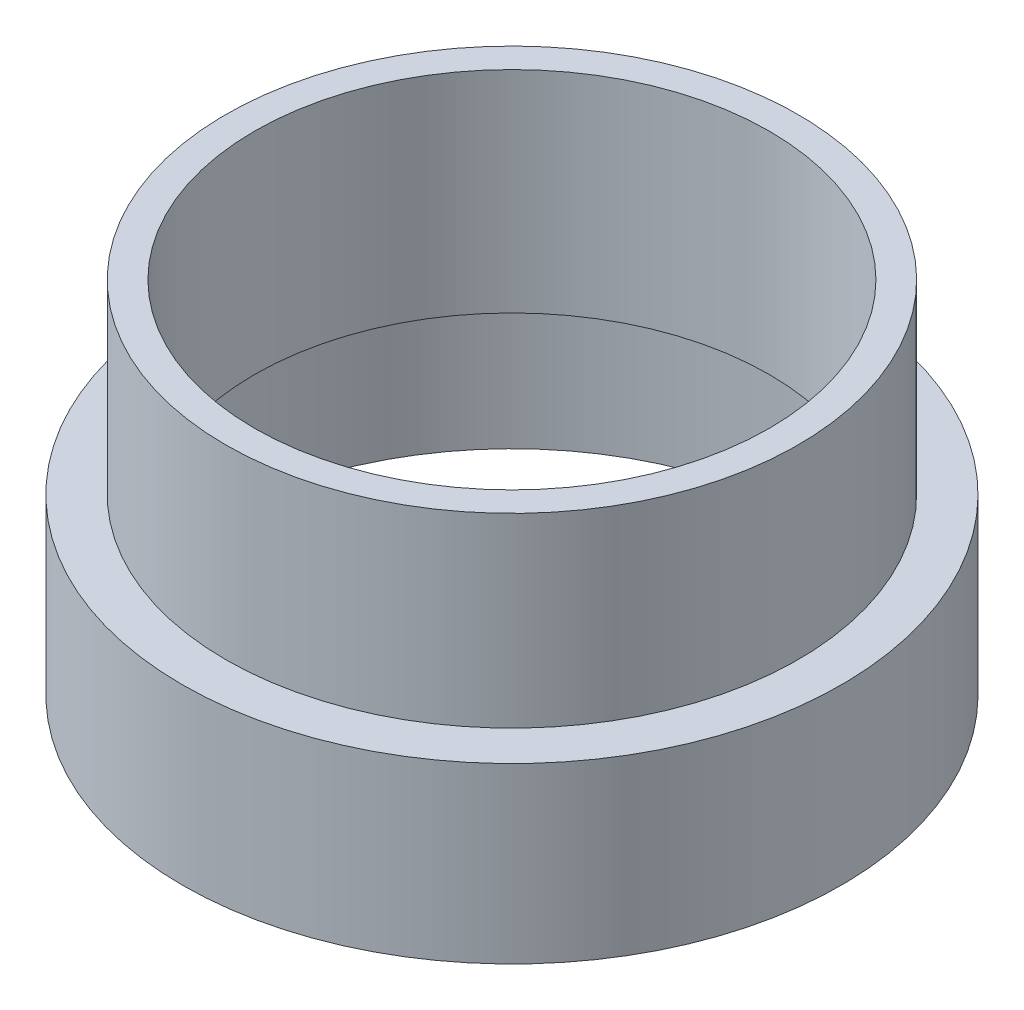
ISO-10303-21;
HEADER;
FILE_DESCRIPTION(('STEP AP214'),'2;1');
FILE_NAME('part.step','',(''),(''),'','','');
FILE_SCHEMA(('AUTOMOTIVE_DESIGN { 1 0 10303 214 1 1 1 1 }'));
ENDSEC;
DATA;
#1=APPLICATION_CONTEXT('core data for automotive mechanical design processes');
#2=APPLICATION_PROTOCOL_DEFINITION('international standard','automotive_design',2000,#1);
#3=PRODUCT_CONTEXT('',#1,'mechanical');
#4=PRODUCT('Part','Part','',(#3));
#5=PRODUCT_RELATED_PRODUCT_CATEGORY('part','',(#4));
#6=PRODUCT_DEFINITION_FORMATION('','',#4);
#7=PRODUCT_DEFINITION_CONTEXT('part definition',#1,'design');
#8=PRODUCT_DEFINITION('design','',#6,#7);
#9=PRODUCT_DEFINITION_SHAPE('','',#8);
#10=(LENGTH_UNIT() NAMED_UNIT(*) SI_UNIT(.MILLI.,.METRE.));
#11=(NAMED_UNIT(*) PLANE_ANGLE_UNIT() SI_UNIT($,.RADIAN.));
#12=(NAMED_UNIT(*) SI_UNIT($,.STERADIAN.) SOLID_ANGLE_UNIT());
#13=UNCERTAINTY_MEASURE_WITH_UNIT(LENGTH_MEASURE(1.E-05),#10,'distance_accuracy_value','');
#14=(GEOMETRIC_REPRESENTATION_CONTEXT(3) GLOBAL_UNCERTAINTY_ASSIGNED_CONTEXT((#13)) GLOBAL_UNIT_ASSIGNED_CONTEXT((#10,
#11,#12)) REPRESENTATION_CONTEXT('',''));
#15=CARTESIAN_POINT('',(0.,0.,0.));
#16=DIRECTION('',(0.,0.,1.));
#17=DIRECTION('',(1.,0.,0.));
#18=AXIS2_PLACEMENT_3D('',#15,#16,#17);
#19=CARTESIAN_POINT('',(0.,7.,0.));
#20=DIRECTION('',(0.,1.,0.));
#21=DIRECTION('',(0.,0.,1.));
#22=AXIS2_PLACEMENT_3D('',#19,#20,#21);
#23=PLANE('',#22);
#24=CARTESIAN_POINT('',(0.,7.,0.));
#25=DIRECTION('',(0.,1.,0.));
#26=DIRECTION('',(0.,0.,1.));
#27=AXIS2_PLACEMENT_3D('',#24,#25,#26);
#28=CIRCLE('',#27,13.29);
#29=CARTESIAN_POINT('',(0.,7.,13.29));
#30=VERTEX_POINT('',#29);
#31=EDGE_CURVE('E10',#30,#30,#28,.T.);
#32=ORIENTED_EDGE('',*,*,#31,.T.);
#33=EDGE_LOOP('',(#32));
#34=FACE_BOUND('',#33,.T.);
#35=CARTESIAN_POINT('',(0.,7.,0.));
#36=DIRECTION('',(0.,1.,0.));
#37=DIRECTION('',(0.,0.,1.));
#38=AXIS2_PLACEMENT_3D('',#35,#36,#37);
#39=CIRCLE('',#38,11.54);
#40=CARTESIAN_POINT('',(0.,7.,11.54));
#41=VERTEX_POINT('',#40);
#42=EDGE_CURVE('E46',#41,#41,#39,.T.);
#43=ORIENTED_EDGE('',*,*,#42,.F.);
#44=EDGE_LOOP('',(#43));
#45=FACE_BOUND('',#44,.T.);
#46=ADVANCED_FACE('F31',(#34,#45),#23,.T.);
#47=CARTESIAN_POINT('',(0.,7.,0.));
#48=DIRECTION('',(0.,-1.,0.));
#49=DIRECTION('',(0.,0.,-1.));
#50=AXIS2_PLACEMENT_3D('',#47,#48,#49);
#51=CYLINDRICAL_SURFACE('',#50,13.29);
#52=ORIENTED_EDGE('',*,*,#31,.F.);
#53=EDGE_LOOP('',(#52));
#54=FACE_BOUND('',#53,.T.);
#55=CARTESIAN_POINT('',(0.,0.,0.));
#56=DIRECTION('',(0.,1.,0.));
#57=DIRECTION('',(0.,0.,1.));
#58=AXIS2_PLACEMENT_3D('',#55,#56,#57);
#59=CIRCLE('',#58,13.29);
#60=CARTESIAN_POINT('',(0.,0.,13.29));
#61=VERTEX_POINT('',#60);
#62=EDGE_CURVE('E39',#61,#61,#59,.T.);
#63=ORIENTED_EDGE('',*,*,#62,.T.);
#64=EDGE_LOOP('',(#63));
#65=FACE_BOUND('',#64,.T.);
#66=ADVANCED_FACE('F33',(#54,#65),#51,.T.);
#67=CARTESIAN_POINT('',(0.,0.,0.));
#68=DIRECTION('',(0.,1.,0.));
#69=DIRECTION('',(0.,0.,1.));
#70=AXIS2_PLACEMENT_3D('',#67,#68,#69);
#71=PLANE('',#70);
#72=CARTESIAN_POINT('',(0.,0.,0.));
#73=DIRECTION('',(0.,-1.,0.));
#74=DIRECTION('',(0.,0.,-1.));
#75=AXIS2_PLACEMENT_3D('',#72,#73,#74);
#76=CIRCLE('',#75,12.16);
#77=CARTESIAN_POINT('',(0.,0.,-12.16));
#78=VERTEX_POINT('',#77);
#79=EDGE_CURVE('E52',#78,#78,#76,.T.);
#80=ORIENTED_EDGE('',*,*,#79,.F.);
#81=EDGE_LOOP('',(#80));
#82=FACE_BOUND('',#81,.T.);
#83=ORIENTED_EDGE('',*,*,#62,.F.);
#84=EDGE_LOOP('',(#83));
#85=FACE_BOUND('',#84,.T.);
#86=ADVANCED_FACE('F79',(#82,#85),#71,.F.);
#87=CARTESIAN_POINT('',(0.,14.5,0.));
#88=DIRECTION('',(0.,-1.,0.));
#89=DIRECTION('',(0.,0.,-1.));
#90=AXIS2_PLACEMENT_3D('',#87,#88,#89);
#91=CYLINDRICAL_SURFACE('',#90,11.54);
#92=CARTESIAN_POINT('',(0.,14.5,0.));
#93=DIRECTION('',(0.,1.,0.));
#94=DIRECTION('',(0.,0.,1.));
#95=AXIS2_PLACEMENT_3D('',#92,#93,#94);
#96=CIRCLE('',#95,11.54);
#97=CARTESIAN_POINT('',(0.,14.5,11.54));
#98=VERTEX_POINT('',#97);
#99=EDGE_CURVE('E44',#98,#98,#96,.T.);
#100=ORIENTED_EDGE('',*,*,#99,.F.);
#101=EDGE_LOOP('',(#100));
#102=FACE_BOUND('',#101,.T.);
#103=ORIENTED_EDGE('',*,*,#42,.T.);
#104=EDGE_LOOP('',(#103));
#105=FACE_BOUND('',#104,.T.);
#106=ADVANCED_FACE('F82',(#102,#105),#91,.T.);
#107=CARTESIAN_POINT('',(0.,14.5,0.));
#108=DIRECTION('',(0.,1.,0.));
#109=DIRECTION('',(0.,0.,1.));
#110=AXIS2_PLACEMENT_3D('',#107,#108,#109);
#111=PLANE('',#110);
#112=CARTESIAN_POINT('',(0.,14.5,0.));
#113=DIRECTION('',(0.,1.,0.));
#114=DIRECTION('',(0.,0.,1.));
#115=AXIS2_PLACEMENT_3D('',#112,#113,#114);
#116=CIRCLE('',#115,10.38);
#117=CARTESIAN_POINT('',(0.,14.5,10.38));
#118=VERTEX_POINT('',#117);
#119=EDGE_CURVE('E57',#118,#118,#116,.T.);
#120=ORIENTED_EDGE('',*,*,#119,.F.);
#121=EDGE_LOOP('',(#120));
#122=FACE_BOUND('',#121,.T.);
#123=ORIENTED_EDGE('',*,*,#99,.T.);
#124=EDGE_LOOP('',(#123));
#125=FACE_BOUND('',#124,.T.);
#126=ADVANCED_FACE('F75',(#122,#125),#111,.T.);
#127=CARTESIAN_POINT('',(0.,6.,0.));
#128=DIRECTION('',(0.,-1.,0.));
#129=DIRECTION('',(0.,0.,-1.));
#130=AXIS2_PLACEMENT_3D('',#127,#128,#129);
#131=CYLINDRICAL_SURFACE('',#130,12.16);
#132=CARTESIAN_POINT('',(0.,6.,0.));
#133=DIRECTION('',(0.,-1.,0.));
#134=DIRECTION('',(0.,0.,-1.));
#135=AXIS2_PLACEMENT_3D('',#132,#133,#134);
#136=CIRCLE('',#135,12.16);
#137=CARTESIAN_POINT('',(0.,6.,-12.16));
#138=VERTEX_POINT('',#137);
#139=EDGE_CURVE('E49',#138,#138,#136,.T.);
#140=ORIENTED_EDGE('',*,*,#139,.F.);
#141=EDGE_LOOP('',(#140));
#142=FACE_BOUND('',#141,.T.);
#143=ORIENTED_EDGE('',*,*,#79,.T.);
#144=EDGE_LOOP('',(#143));
#145=FACE_BOUND('',#144,.T.);
#146=ADVANCED_FACE('F69',(#142,#145),#131,.F.);
#147=CARTESIAN_POINT('',(0.,6.,0.));
#148=DIRECTION('',(0.,-1.,0.));
#149=DIRECTION('',(0.,0.,-1.));
#150=AXIS2_PLACEMENT_3D('',#147,#148,#149);
#151=PLANE('',#150);
#152=CARTESIAN_POINT('',(0.,6.,0.));
#153=DIRECTION('',(0.,-1.,0.));
#154=DIRECTION('',(0.,0.,-1.));
#155=AXIS2_PLACEMENT_3D('',#152,#153,#154);
#156=CIRCLE('',#155,10.38);
#157=CARTESIAN_POINT('',(0.,6.,-10.38));
#158=VERTEX_POINT('',#157);
#159=EDGE_CURVE('E35',#158,#158,#156,.T.);
#160=ORIENTED_EDGE('',*,*,#159,.F.);
#161=EDGE_LOOP('',(#160));
#162=FACE_BOUND('',#161,.T.);
#163=ORIENTED_EDGE('',*,*,#139,.T.);
#164=EDGE_LOOP('',(#163));
#165=FACE_BOUND('',#164,.T.);
#166=ADVANCED_FACE('F66',(#162,#165),#151,.T.);
#167=CARTESIAN_POINT('',(0.,5.5,0.));
#168=DIRECTION('',(0.,1.,0.));
#169=DIRECTION('',(0.,0.,1.));
#170=AXIS2_PLACEMENT_3D('',#167,#168,#169);
#171=CYLINDRICAL_SURFACE('',#170,10.38);
#172=ORIENTED_EDGE('',*,*,#159,.T.);
#173=EDGE_LOOP('',(#172));
#174=FACE_BOUND('',#173,.T.);
#175=ORIENTED_EDGE('',*,*,#119,.T.);
#176=EDGE_LOOP('',(#175));
#177=FACE_BOUND('',#176,.T.);
#178=ADVANCED_FACE('F64',(#174,#177),#171,.F.);
#179=CLOSED_SHELL('',(#46,#66,#86,#106,#126,#146,#166,#178));
#180=MANIFOLD_SOLID_BREP('B2',#179);
#181=ADVANCED_BREP_SHAPE_REPRESENTATION('',(#18,#180),#14);
#182=SHAPE_DEFINITION_REPRESENTATION(#9,#181);
ENDSEC;
END-ISO-10303-21;
